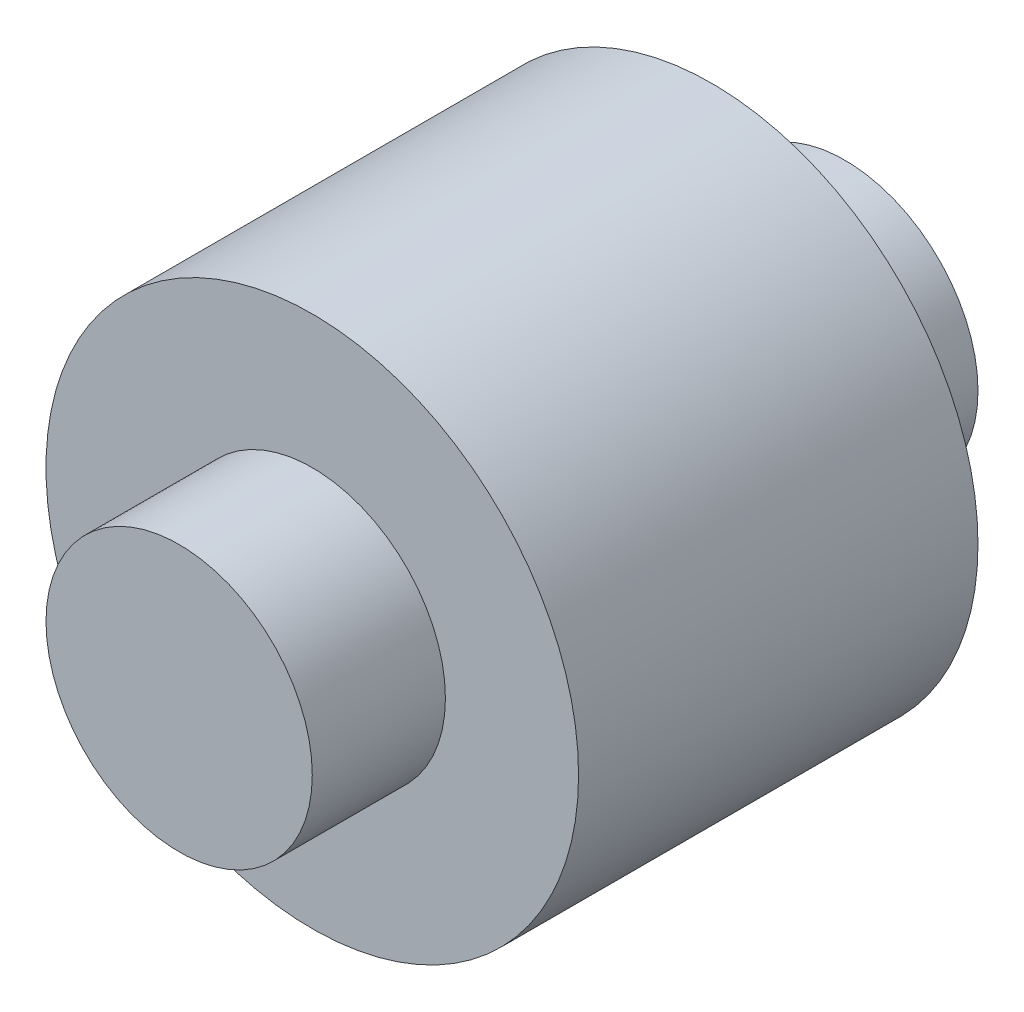
ISO-10303-21;
HEADER;
FILE_DESCRIPTION(('STEP AP214'),'2;1');
FILE_NAME('part.step','',(''),(''),'','','');
FILE_SCHEMA(('AUTOMOTIVE_DESIGN { 1 0 10303 214 1 1 1 1 }'));
ENDSEC;
DATA;
#1=APPLICATION_CONTEXT('core data for automotive mechanical design processes');
#2=APPLICATION_PROTOCOL_DEFINITION('international standard','automotive_design',2000,#1);
#3=PRODUCT_CONTEXT('',#1,'mechanical');
#4=PRODUCT('Part','Part','',(#3));
#5=PRODUCT_RELATED_PRODUCT_CATEGORY('part','',(#4));
#6=PRODUCT_DEFINITION_FORMATION('','',#4);
#7=PRODUCT_DEFINITION_CONTEXT('part definition',#1,'design');
#8=PRODUCT_DEFINITION('design','',#6,#7);
#9=PRODUCT_DEFINITION_SHAPE('','',#8);
#10=(LENGTH_UNIT() NAMED_UNIT(*) SI_UNIT(.MILLI.,.METRE.));
#11=(NAMED_UNIT(*) PLANE_ANGLE_UNIT() SI_UNIT($,.RADIAN.));
#12=(NAMED_UNIT(*) SI_UNIT($,.STERADIAN.) SOLID_ANGLE_UNIT());
#13=UNCERTAINTY_MEASURE_WITH_UNIT(LENGTH_MEASURE(1.E-05),#10,'distance_accuracy_value','');
#14=(GEOMETRIC_REPRESENTATION_CONTEXT(3) GLOBAL_UNCERTAINTY_ASSIGNED_CONTEXT((#13)) GLOBAL_UNIT_ASSIGNED_CONTEXT((#10,
#11,#12)) REPRESENTATION_CONTEXT('',''));
#15=CARTESIAN_POINT('',(0.,0.,0.));
#16=DIRECTION('',(0.,0.,1.));
#17=DIRECTION('',(1.,0.,0.));
#18=AXIS2_PLACEMENT_3D('',#15,#16,#17);
#19=CARTESIAN_POINT('',(0.,0.,15.));
#20=DIRECTION('',(0.,0.,-1.));
#21=DIRECTION('',(-1.,0.,0.));
#22=AXIS2_PLACEMENT_3D('',#19,#20,#21);
#23=CYLINDRICAL_SURFACE('',#22,10.);
#24=CARTESIAN_POINT('',(0.,0.,15.));
#25=DIRECTION('',(0.,0.,1.));
#26=DIRECTION('',(1.,0.,0.));
#27=AXIS2_PLACEMENT_3D('',#24,#25,#26);
#28=CIRCLE('',#27,10.);
#29=CARTESIAN_POINT('',(10.,0.,15.));
#30=VERTEX_POINT('',#29);
#31=EDGE_CURVE('E49',#30,#30,#28,.T.);
#32=ORIENTED_EDGE('',*,*,#31,.F.);
#33=EDGE_LOOP('',(#32));
#34=FACE_BOUND('',#33,.T.);
#35=CARTESIAN_POINT('',(0.,0.,0.));
#36=DIRECTION('',(0.,0.,1.));
#37=DIRECTION('',(1.,0.,0.));
#38=AXIS2_PLACEMENT_3D('',#35,#36,#37);
#39=CIRCLE('',#38,10.);
#40=CARTESIAN_POINT('',(10.,0.,0.));
#41=VERTEX_POINT('',#40);
#42=EDGE_CURVE('E44',#41,#41,#39,.T.);
#43=ORIENTED_EDGE('',*,*,#42,.T.);
#44=EDGE_LOOP('',(#43));
#45=FACE_BOUND('',#44,.T.);
#46=ADVANCED_FACE('F41',(#34,#45),#23,.T.);
#47=CARTESIAN_POINT('',(0.,0.,15.));
#48=DIRECTION('',(0.,0.,1.));
#49=DIRECTION('',(1.,0.,0.));
#50=AXIS2_PLACEMENT_3D('',#47,#48,#49);
#51=PLANE('',#50);
#52=CARTESIAN_POINT('',(0.,0.,15.));
#53=DIRECTION('',(0.,0.,1.));
#54=DIRECTION('',(1.,0.,0.));
#55=AXIS2_PLACEMENT_3D('',#52,#53,#54);
#56=CIRCLE('',#55,5.);
#57=CARTESIAN_POINT('',(5.,0.,15.));
#58=VERTEX_POINT('',#57);
#59=EDGE_CURVE('E10',#58,#58,#56,.T.);
#60=ORIENTED_EDGE('',*,*,#59,.F.);
#61=EDGE_LOOP('',(#60));
#62=FACE_BOUND('',#61,.T.);
#63=ORIENTED_EDGE('',*,*,#31,.T.);
#64=EDGE_LOOP('',(#63));
#65=FACE_BOUND('',#64,.T.);
#66=ADVANCED_FACE('F81',(#62,#65),#51,.T.);
#67=CARTESIAN_POINT('',(0.,0.,0.));
#68=DIRECTION('',(0.,0.,1.));
#69=DIRECTION('',(1.,0.,0.));
#70=AXIS2_PLACEMENT_3D('',#67,#68,#69);
#71=PLANE('',#70);
#72=CARTESIAN_POINT('',(0.,0.,0.));
#73=DIRECTION('',(0.,0.,1.));
#74=DIRECTION('',(1.,0.,0.));
#75=AXIS2_PLACEMENT_3D('',#72,#73,#74);
#76=CIRCLE('',#75,5.);
#77=CARTESIAN_POINT('',(5.,0.,0.));
#78=VERTEX_POINT('',#77);
#79=EDGE_CURVE('E61',#78,#78,#76,.T.);
#80=ORIENTED_EDGE('',*,*,#79,.T.);
#81=EDGE_LOOP('',(#80));
#82=FACE_BOUND('',#81,.T.);
#83=ORIENTED_EDGE('',*,*,#42,.F.);
#84=EDGE_LOOP('',(#83));
#85=FACE_BOUND('',#84,.T.);
#86=ADVANCED_FACE('F87',(#82,#85),#71,.F.);
#87=CARTESIAN_POINT('',(0.,0.,20.));
#88=DIRECTION('',(0.,0.,-1.));
#89=DIRECTION('',(-1.,0.,0.));
#90=AXIS2_PLACEMENT_3D('',#87,#88,#89);
#91=CYLINDRICAL_SURFACE('',#90,5.);
#92=CARTESIAN_POINT('',(0.,0.,20.));
#93=DIRECTION('',(0.,0.,1.));
#94=DIRECTION('',(1.,0.,0.));
#95=AXIS2_PLACEMENT_3D('',#92,#93,#94);
#96=CIRCLE('',#95,5.);
#97=CARTESIAN_POINT('',(5.,0.,20.));
#98=VERTEX_POINT('',#97);
#99=EDGE_CURVE('E56',#98,#98,#96,.T.);
#100=ORIENTED_EDGE('',*,*,#99,.F.);
#101=EDGE_LOOP('',(#100));
#102=FACE_BOUND('',#101,.T.);
#103=ORIENTED_EDGE('',*,*,#59,.T.);
#104=EDGE_LOOP('',(#103));
#105=FACE_BOUND('',#104,.T.);
#106=ADVANCED_FACE('F97',(#102,#105),#91,.T.);
#107=CARTESIAN_POINT('',(0.,0.,20.));
#108=DIRECTION('',(0.,0.,1.));
#109=DIRECTION('',(1.,0.,0.));
#110=AXIS2_PLACEMENT_3D('',#107,#108,#109);
#111=PLANE('',#110);
#112=ORIENTED_EDGE('',*,*,#99,.T.);
#113=EDGE_LOOP('',(#112));
#114=FACE_BOUND('',#113,.T.);
#115=ADVANCED_FACE('F78',(#114),#111,.T.);
#116=CARTESIAN_POINT('',(0.,0.,-5.));
#117=DIRECTION('',(0.,0.,1.));
#118=DIRECTION('',(1.,0.,0.));
#119=AXIS2_PLACEMENT_3D('',#116,#117,#118);
#120=CYLINDRICAL_SURFACE('',#119,5.);
#121=CARTESIAN_POINT('',(0.,0.,-5.));
#122=DIRECTION('',(0.,0.,1.));
#123=DIRECTION('',(1.,0.,0.));
#124=AXIS2_PLACEMENT_3D('',#121,#122,#123);
#125=CIRCLE('',#124,5.);
#126=CARTESIAN_POINT('',(5.,0.,-5.));
#127=VERTEX_POINT('',#126);
#128=EDGE_CURVE('E60',#127,#127,#125,.T.);
#129=ORIENTED_EDGE('',*,*,#128,.T.);
#130=EDGE_LOOP('',(#129));
#131=FACE_BOUND('',#130,.T.);
#132=ORIENTED_EDGE('',*,*,#79,.F.);
#133=EDGE_LOOP('',(#132));
#134=FACE_BOUND('',#133,.T.);
#135=ADVANCED_FACE('F69',(#131,#134),#120,.T.);
#136=CARTESIAN_POINT('',(0.,0.,-5.));
#137=DIRECTION('',(0.,0.,-1.));
#138=DIRECTION('',(1.,0.,0.));
#139=AXIS2_PLACEMENT_3D('',#136,#137,#138);
#140=PLANE('',#139);
#141=ORIENTED_EDGE('',*,*,#128,.F.);
#142=EDGE_LOOP('',(#141));
#143=FACE_BOUND('',#142,.T.);
#144=ADVANCED_FACE('F72',(#143),#140,.T.);
#145=CLOSED_SHELL('',(#46,#66,#86,#106,#115,#135,#144));
#146=MANIFOLD_SOLID_BREP('B2',#145);
#147=ADVANCED_BREP_SHAPE_REPRESENTATION('',(#18,#146),#14);
#148=SHAPE_DEFINITION_REPRESENTATION(#9,#147);
ENDSEC;
END-ISO-10303-21;
